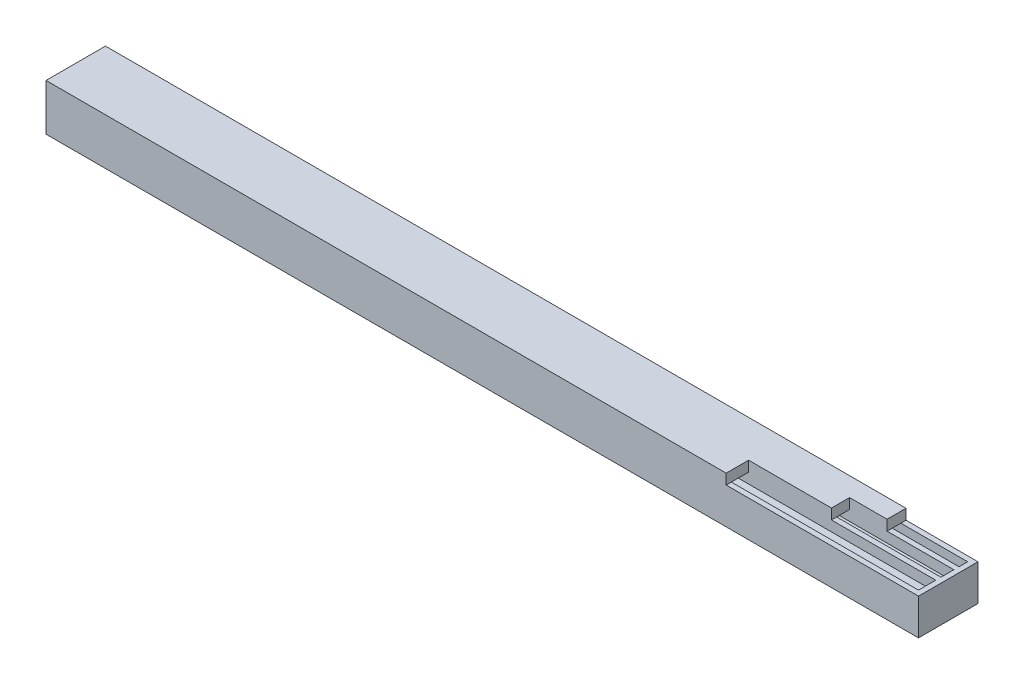
ISO-10303-21;
HEADER;
FILE_DESCRIPTION(('STEP AP214'),'2;1');
FILE_NAME('part.step','',(''),(''),'','','');
FILE_SCHEMA(('AUTOMOTIVE_DESIGN { 1 0 10303 214 1 1 1 1 }'));
ENDSEC;
DATA;
#1=APPLICATION_CONTEXT('core data for automotive mechanical design processes');
#2=APPLICATION_PROTOCOL_DEFINITION('international standard','automotive_design',2000,#1);
#3=PRODUCT_CONTEXT('',#1,'mechanical');
#4=PRODUCT('Part','Part','',(#3));
#5=PRODUCT_RELATED_PRODUCT_CATEGORY('part','',(#4));
#6=PRODUCT_DEFINITION_FORMATION('','',#4);
#7=PRODUCT_DEFINITION_CONTEXT('part definition',#1,'design');
#8=PRODUCT_DEFINITION('design','',#6,#7);
#9=PRODUCT_DEFINITION_SHAPE('','',#8);
#10=(LENGTH_UNIT() NAMED_UNIT(*) SI_UNIT(.MILLI.,.METRE.));
#11=(NAMED_UNIT(*) PLANE_ANGLE_UNIT() SI_UNIT($,.RADIAN.));
#12=(NAMED_UNIT(*) SI_UNIT($,.STERADIAN.) SOLID_ANGLE_UNIT());
#13=UNCERTAINTY_MEASURE_WITH_UNIT(LENGTH_MEASURE(1.E-05),#10,'distance_accuracy_value','');
#14=(GEOMETRIC_REPRESENTATION_CONTEXT(3) GLOBAL_UNCERTAINTY_ASSIGNED_CONTEXT((#13)) GLOBAL_UNIT_ASSIGNED_CONTEXT((#10,
#11,#12)) REPRESENTATION_CONTEXT('',''));
#15=CARTESIAN_POINT('',(0.,0.,0.));
#16=DIRECTION('',(0.,0.,1.));
#17=DIRECTION('',(1.,0.,0.));
#18=AXIS2_PLACEMENT_3D('',#15,#16,#17);
#19=CARTESIAN_POINT('',(-3.,-15.,26.5));
#20=DIRECTION('',(-1.,0.,0.));
#21=DIRECTION('',(0.,0.,1.));
#22=AXIS2_PLACEMENT_3D('',#19,#20,#21);
#23=PLANE('',#22);
#24=DIRECTION('',(0.,1.,0.));
#25=VECTOR('',#24,1.);
#26=CARTESIAN_POINT('',(-3.,-15.,26.5));
#27=LINE('',#26,#25);
#28=CARTESIAN_POINT('',(-3.,-15.,26.5));
#29=VERTEX_POINT('',#28);
#30=CARTESIAN_POINT('',(-3.,12.,26.5));
#31=VERTEX_POINT('',#30);
#32=EDGE_CURVE('E36',#29,#31,#27,.T.);
#33=ORIENTED_EDGE('',*,*,#32,.T.);
#34=DIRECTION('',(0.,0.,1.));
#35=VECTOR('',#34,1.);
#36=CARTESIAN_POINT('',(-3.,12.,26.5));
#37=LINE('',#36,#35);
#38=CARTESIAN_POINT('',(-3.,12.,-8.));
#39=VERTEX_POINT('',#38);
#40=EDGE_CURVE('E211',#39,#31,#37,.T.);
#41=ORIENTED_EDGE('',*,*,#40,.F.);
#42=DIRECTION('',(0.,1.,0.));
#43=VECTOR('',#42,1.);
#44=CARTESIAN_POINT('',(-3.,-15.,-8.));
#45=LINE('',#44,#43);
#46=CARTESIAN_POINT('',(-3.,-15.,-8.));
#47=VERTEX_POINT('',#46);
#48=EDGE_CURVE('E41',#47,#39,#45,.T.);
#49=ORIENTED_EDGE('',*,*,#48,.F.);
#50=DIRECTION('',(0.,0.,1.));
#51=VECTOR('',#50,1.);
#52=CARTESIAN_POINT('',(-3.,-15.,26.5));
#53=LINE('',#52,#51);
#54=EDGE_CURVE('E363',#47,#29,#53,.T.);
#55=ORIENTED_EDGE('',*,*,#54,.T.);
#56=EDGE_LOOP('',(#33,#41,#49,#55));
#57=FACE_BOUND('',#56,.T.);
#58=ADVANCED_FACE('F33',(#57),#23,.T.);
#59=CARTESIAN_POINT('',(-3.,-15.,-8.));
#60=DIRECTION('',(0.,0.,-1.));
#61=DIRECTION('',(-1.,0.,0.));
#62=AXIS2_PLACEMENT_3D('',#59,#60,#61);
#63=PLANE('',#62);
#64=ORIENTED_EDGE('',*,*,#48,.T.);
#65=DIRECTION('',(-1.,0.,0.));
#66=VECTOR('',#65,1.);
#67=CARTESIAN_POINT('',(-3.,12.,-8.));
#68=LINE('',#67,#66);
#69=CARTESIAN_POINT('',(461.264937975209,12.,-8.));
#70=VERTEX_POINT('',#69);
#71=EDGE_CURVE('E202',#70,#39,#68,.T.);
#72=ORIENTED_EDGE('',*,*,#71,.F.);
#73=DIRECTION('',(0.,-1.,0.));
#74=VECTOR('',#73,1.);
#75=CARTESIAN_POINT('',(461.264937975209,12.,-8.));
#76=LINE('',#75,#74);
#77=CARTESIAN_POINT('',(461.264937975209,5.99999999999999,-8.));
#78=VERTEX_POINT('',#77);
#79=EDGE_CURVE('E233',#70,#78,#76,.T.);
#80=ORIENTED_EDGE('',*,*,#79,.T.);
#81=DIRECTION('',(-1.,0.,0.));
#82=VECTOR('',#81,1.);
#83=CARTESIAN_POINT('',(-3.,5.99999999999999,-8.));
#84=LINE('',#83,#82);
#85=CARTESIAN_POINT('',(503.,5.99999999999999,-8.));
#86=VERTEX_POINT('',#85);
#87=EDGE_CURVE('E361',#86,#78,#84,.T.);
#88=ORIENTED_EDGE('',*,*,#87,.F.);
#89=DIRECTION('',(0.,1.,0.));
#90=VECTOR('',#89,1.);
#91=CARTESIAN_POINT('',(503.,-15.,-8.));
#92=LINE('',#91,#90);
#93=CARTESIAN_POINT('',(503.,-15.,-8.));
#94=VERTEX_POINT('',#93);
#95=EDGE_CURVE('E208',#94,#86,#92,.T.);
#96=ORIENTED_EDGE('',*,*,#95,.F.);
#97=DIRECTION('',(-1.,0.,0.));
#98=VECTOR('',#97,1.);
#99=CARTESIAN_POINT('',(-3.,-15.,-8.));
#100=LINE('',#99,#98);
#101=EDGE_CURVE('E204',#94,#47,#100,.T.);
#102=ORIENTED_EDGE('',*,*,#101,.T.);
#103=EDGE_LOOP('',(#64,#72,#80,#88,#96,#102));
#104=FACE_BOUND('',#103,.T.);
#105=ADVANCED_FACE('F199',(#104),#63,.T.);
#106=CARTESIAN_POINT('',(503.,-15.,26.5));
#107=DIRECTION('',(1.,0.,0.));
#108=DIRECTION('',(0.,0.,-1.));
#109=AXIS2_PLACEMENT_3D('',#106,#107,#108);
#110=PLANE('',#109);
#111=ORIENTED_EDGE('',*,*,#95,.T.);
#112=DIRECTION('',(0.,0.,-1.));
#113=VECTOR('',#112,1.);
#114=CARTESIAN_POINT('',(503.,5.99999999999999,-8.));
#115=LINE('',#114,#113);
#116=CARTESIAN_POINT('',(503.,5.99999999999999,26.5));
#117=VERTEX_POINT('',#116);
#118=EDGE_CURVE('E358',#117,#86,#115,.T.);
#119=ORIENTED_EDGE('',*,*,#118,.F.);
#120=DIRECTION('',(0.,1.,0.));
#121=VECTOR('',#120,1.);
#122=CARTESIAN_POINT('',(503.,-15.,26.5));
#123=LINE('',#122,#121);
#124=CARTESIAN_POINT('',(503.,-15.,26.5));
#125=VERTEX_POINT('',#124);
#126=EDGE_CURVE('E372',#125,#117,#123,.T.);
#127=ORIENTED_EDGE('',*,*,#126,.F.);
#128=DIRECTION('',(0.,0.,-1.));
#129=VECTOR('',#128,1.);
#130=CARTESIAN_POINT('',(503.,-15.,26.5));
#131=LINE('',#130,#129);
#132=EDGE_CURVE('E368',#125,#94,#131,.T.);
#133=ORIENTED_EDGE('',*,*,#132,.T.);
#134=EDGE_LOOP('',(#111,#119,#127,#133));
#135=FACE_BOUND('',#134,.T.);
#136=ADVANCED_FACE('F382',(#135),#110,.T.);
#137=CARTESIAN_POINT('',(-3.,-15.,26.5));
#138=DIRECTION('',(0.,0.,1.));
#139=DIRECTION('',(1.,0.,0.));
#140=AXIS2_PLACEMENT_3D('',#137,#138,#139);
#141=PLANE('',#140);
#142=ORIENTED_EDGE('',*,*,#126,.T.);
#143=DIRECTION('',(1.,0.,0.));
#144=VECTOR('',#143,1.);
#145=CARTESIAN_POINT('',(-3.,5.99999999999999,26.5));
#146=LINE('',#145,#144);
#147=CARTESIAN_POINT('',(391.456572890163,5.99999999999999,26.5));
#148=VERTEX_POINT('',#147);
#149=EDGE_CURVE('E356',#148,#117,#146,.T.);
#150=ORIENTED_EDGE('',*,*,#149,.F.);
#151=DIRECTION('',(0.,-1.,0.));
#152=VECTOR('',#151,1.);
#153=CARTESIAN_POINT('',(391.456572890163,12.,26.5));
#154=LINE('',#153,#152);
#155=CARTESIAN_POINT('',(391.456572890163,12.,26.5));
#156=VERTEX_POINT('',#155);
#157=EDGE_CURVE('E255',#156,#148,#154,.T.);
#158=ORIENTED_EDGE('',*,*,#157,.F.);
#159=DIRECTION('',(1.,0.,0.));
#160=VECTOR('',#159,1.);
#161=CARTESIAN_POINT('',(391.456572890163,12.,26.5));
#162=LINE('',#161,#160);
#163=EDGE_CURVE('E214',#31,#156,#162,.T.);
#164=ORIENTED_EDGE('',*,*,#163,.F.);
#165=ORIENTED_EDGE('',*,*,#32,.F.);
#166=DIRECTION('',(1.,0.,0.));
#167=VECTOR('',#166,1.);
#168=CARTESIAN_POINT('',(-3.,-15.,26.5));
#169=LINE('',#168,#167);
#170=EDGE_CURVE('E365',#29,#125,#169,.T.);
#171=ORIENTED_EDGE('',*,*,#170,.T.);
#172=EDGE_LOOP('',(#142,#150,#158,#164,#165,#171));
#173=FACE_BOUND('',#172,.T.);
#174=ADVANCED_FACE('F377',(#173),#141,.T.);
#175=CARTESIAN_POINT('',(0.,-15.,0.));
#176=DIRECTION('',(0.,-1.,0.));
#177=DIRECTION('',(0.,0.,-1.));
#178=AXIS2_PLACEMENT_3D('',#175,#176,#177);
#179=PLANE('',#178);
#180=ORIENTED_EDGE('',*,*,#54,.F.);
#181=ORIENTED_EDGE('',*,*,#101,.F.);
#182=ORIENTED_EDGE('',*,*,#132,.F.);
#183=ORIENTED_EDGE('',*,*,#170,.F.);
#184=EDGE_LOOP('',(#180,#181,#182,#183));
#185=FACE_BOUND('',#184,.T.);
#186=ADVANCED_FACE('F485',(#185),#179,.T.);
#187=CARTESIAN_POINT('',(0.,5.99999999999999,0.));
#188=DIRECTION('',(0.,1.,0.));
#189=DIRECTION('',(0.,0.,1.));
#190=AXIS2_PLACEMENT_3D('',#187,#188,#189);
#191=PLANE('',#190);
#192=DIRECTION('',(0.,0.,-1.));
#193=VECTOR('',#192,1.);
#194=CARTESIAN_POINT('',(461.264937975209,5.99999999999999,-8.));
#195=LINE('',#194,#193);
#196=CARTESIAN_POINT('',(461.264937975209,5.99999999999999,3.));
#197=VERTEX_POINT('',#196);
#198=CARTESIAN_POINT('',(461.264937975209,5.99999999999999,0.));
#199=VERTEX_POINT('',#198);
#200=EDGE_CURVE('E43',#197,#199,#195,.T.);
#201=ORIENTED_EDGE('',*,*,#200,.F.);
#202=DIRECTION('',(-1.,0.,0.));
#203=VECTOR('',#202,1.);
#204=CARTESIAN_POINT('',(500.,5.99999999999999,3.));
#205=LINE('',#204,#203);
#206=CARTESIAN_POINT('',(500.,5.99999999999999,3.));
#207=VERTEX_POINT('',#206);
#208=EDGE_CURVE('E262',#207,#197,#205,.T.);
#209=ORIENTED_EDGE('',*,*,#208,.F.);
#210=DIRECTION('',(0.,0.,-1.));
#211=VECTOR('',#210,1.);
#212=CARTESIAN_POINT('',(500.,5.99999999999999,3.));
#213=LINE('',#212,#211);
#214=CARTESIAN_POINT('',(500.,5.99999999999999,10.5));
#215=VERTEX_POINT('',#214);
#216=EDGE_CURVE('E259',#215,#207,#213,.T.);
#217=ORIENTED_EDGE('',*,*,#216,.F.);
#218=DIRECTION('',(1.,0.,0.));
#219=VECTOR('',#218,1.);
#220=CARTESIAN_POINT('',(500.,5.99999999999999,10.5));
#221=LINE('',#220,#219);
#222=CARTESIAN_POINT('',(439.515598099466,5.99999999999999,10.5));
#223=VERTEX_POINT('',#222);
#224=EDGE_CURVE('E51',#223,#215,#221,.T.);
#225=ORIENTED_EDGE('',*,*,#224,.F.);
#226=DIRECTION('',(0.,0.,-1.));
#227=VECTOR('',#226,1.);
#228=CARTESIAN_POINT('',(439.515598099466,5.99999999999999,3.));
#229=LINE('',#228,#227);
#230=CARTESIAN_POINT('',(439.515598099466,5.99999999999999,13.5));
#231=VERTEX_POINT('',#230);
#232=EDGE_CURVE('E239',#231,#223,#229,.T.);
#233=ORIENTED_EDGE('',*,*,#232,.F.);
#234=DIRECTION('',(-1.,0.,0.));
#235=VECTOR('',#234,1.);
#236=CARTESIAN_POINT('',(0.,5.99999999999999,13.5));
#237=LINE('',#236,#235);
#238=CARTESIAN_POINT('',(500.,5.99999999999999,13.5));
#239=VERTEX_POINT('',#238);
#240=EDGE_CURVE('E334',#239,#231,#237,.T.);
#241=ORIENTED_EDGE('',*,*,#240,.F.);
#242=DIRECTION('',(0.,0.,-1.));
#243=VECTOR('',#242,1.);
#244=CARTESIAN_POINT('',(500.,5.99999999999999,13.5));
#245=LINE('',#244,#243);
#246=CARTESIAN_POINT('',(500.,5.99999999999999,23.5));
#247=VERTEX_POINT('',#246);
#248=EDGE_CURVE('E330',#247,#239,#245,.T.);
#249=ORIENTED_EDGE('',*,*,#248,.F.);
#250=DIRECTION('',(1.,0.,0.));
#251=VECTOR('',#250,1.);
#252=CARTESIAN_POINT('',(0.,5.99999999999999,23.5));
#253=LINE('',#252,#251);
#254=CARTESIAN_POINT('',(391.456572890163,5.99999999999999,23.5));
#255=VERTEX_POINT('',#254);
#256=EDGE_CURVE('E326',#255,#247,#253,.T.);
#257=ORIENTED_EDGE('',*,*,#256,.F.);
#258=DIRECTION('',(0.,0.,-1.));
#259=VECTOR('',#258,1.);
#260=CARTESIAN_POINT('',(391.456572890163,5.99999999999999,13.5));
#261=LINE('',#260,#259);
#262=EDGE_CURVE('E234',#148,#255,#261,.T.);
#263=ORIENTED_EDGE('',*,*,#262,.F.);
#264=ORIENTED_EDGE('',*,*,#149,.T.);
#265=ORIENTED_EDGE('',*,*,#118,.T.);
#266=ORIENTED_EDGE('',*,*,#87,.T.);
#267=CARTESIAN_POINT('',(461.264937975209,5.99999999999999,-5.));
#268=VERTEX_POINT('',#267);
#269=EDGE_CURVE('E11',#268,#78,#195,.T.);
#270=ORIENTED_EDGE('',*,*,#269,.F.);
#271=DIRECTION('',(-1.,0.,0.));
#272=VECTOR('',#271,1.);
#273=CARTESIAN_POINT('',(0.,5.99999999999999,-5.));
#274=LINE('',#273,#272);
#275=CARTESIAN_POINT('',(500.,5.99999999999999,-5.));
#276=VERTEX_POINT('',#275);
#277=EDGE_CURVE('E301',#276,#268,#274,.T.);
#278=ORIENTED_EDGE('',*,*,#277,.F.);
#279=DIRECTION('',(0.,0.,-1.));
#280=VECTOR('',#279,1.);
#281=CARTESIAN_POINT('',(500.,5.99999999999999,-5.));
#282=LINE('',#281,#280);
#283=CARTESIAN_POINT('',(500.,5.99999999999999,0.));
#284=VERTEX_POINT('',#283);
#285=EDGE_CURVE('E297',#284,#276,#282,.T.);
#286=ORIENTED_EDGE('',*,*,#285,.F.);
#287=DIRECTION('',(1.,0.,0.));
#288=VECTOR('',#287,1.);
#289=CARTESIAN_POINT('',(0.,5.99999999999999,0.));
#290=LINE('',#289,#288);
#291=EDGE_CURVE('E292',#199,#284,#290,.T.);
#292=ORIENTED_EDGE('',*,*,#291,.F.);
#293=EDGE_LOOP('',(#201,#209,#217,#225,#233,#241,#249,#257,#263,#264,#265,#266,#270,#278,#286,#292));
#294=FACE_BOUND('',#293,.T.);
#295=ADVANCED_FACE('F384',(#294),#191,.T.);
#296=CARTESIAN_POINT('',(0.,5.99999999999999,13.5));
#297=DIRECTION('',(1.,0.,0.));
#298=DIRECTION('',(0.,0.,-1.));
#299=AXIS2_PLACEMENT_3D('',#296,#297,#298);
#300=PLANE('',#299);
#301=DIRECTION('',(0.,0.,1.));
#302=VECTOR('',#301,1.);
#303=CARTESIAN_POINT('',(0.,0.,13.5));
#304=LINE('',#303,#302);
#305=CARTESIAN_POINT('',(0.,0.,13.5));
#306=VERTEX_POINT('',#305);
#307=CARTESIAN_POINT('',(0.,0.,23.5));
#308=VERTEX_POINT('',#307);
#309=EDGE_CURVE('E323',#306,#308,#304,.T.);
#310=ORIENTED_EDGE('',*,*,#309,.F.);
#311=DIRECTION('',(0.,-1.,0.));
#312=VECTOR('',#311,1.);
#313=CARTESIAN_POINT('',(0.,5.99999999999999,13.5));
#314=LINE('',#313,#312);
#315=CARTESIAN_POINT('',(0.,5.99999999999999,13.5));
#316=VERTEX_POINT('',#315);
#317=EDGE_CURVE('E337',#316,#306,#314,.T.);
#318=ORIENTED_EDGE('',*,*,#317,.F.);
#319=DIRECTION('',(0.,0.,1.));
#320=VECTOR('',#319,1.);
#321=CARTESIAN_POINT('',(0.,5.99999999999999,13.5));
#322=LINE('',#321,#320);
#323=CARTESIAN_POINT('',(0.,5.99999999999999,23.5));
#324=VERTEX_POINT('',#323);
#325=EDGE_CURVE('E324',#316,#324,#322,.T.);
#326=ORIENTED_EDGE('',*,*,#325,.T.);
#327=DIRECTION('',(0.,-1.,0.));
#328=VECTOR('',#327,1.);
#329=CARTESIAN_POINT('',(0.,5.99999999999999,23.5));
#330=LINE('',#329,#328);
#331=EDGE_CURVE('E353',#324,#308,#330,.T.);
#332=ORIENTED_EDGE('',*,*,#331,.T.);
#333=EDGE_LOOP('',(#310,#318,#326,#332));
#334=FACE_BOUND('',#333,.T.);
#335=ADVANCED_FACE('F460',(#334),#300,.T.);
#336=CARTESIAN_POINT('',(0.,5.99999999999999,23.5));
#337=DIRECTION('',(0.,0.,-1.));
#338=DIRECTION('',(-1.,0.,0.));
#339=AXIS2_PLACEMENT_3D('',#336,#337,#338);
#340=PLANE('',#339);
#341=DIRECTION('',(1.,0.,0.));
#342=VECTOR('',#341,1.);
#343=CARTESIAN_POINT('',(0.,0.,23.5));
#344=LINE('',#343,#342);
#345=CARTESIAN_POINT('',(500.,0.,23.5));
#346=VERTEX_POINT('',#345);
#347=EDGE_CURVE('E340',#308,#346,#344,.T.);
#348=ORIENTED_EDGE('',*,*,#347,.F.);
#349=ORIENTED_EDGE('',*,*,#331,.F.);
#350=EDGE_CURVE('E328',#324,#255,#253,.T.);
#351=ORIENTED_EDGE('',*,*,#350,.T.);
#352=ORIENTED_EDGE('',*,*,#256,.T.);
#353=DIRECTION('',(0.,-1.,0.));
#354=VECTOR('',#353,1.);
#355=CARTESIAN_POINT('',(500.,5.99999999999999,23.5));
#356=LINE('',#355,#354);
#357=EDGE_CURVE('E351',#247,#346,#356,.T.);
#358=ORIENTED_EDGE('',*,*,#357,.T.);
#359=EDGE_LOOP('',(#348,#349,#351,#352,#358));
#360=FACE_BOUND('',#359,.T.);
#361=ADVANCED_FACE('F464',(#360),#340,.T.);
#362=CARTESIAN_POINT('',(500.,5.99999999999999,13.5));
#363=DIRECTION('',(-1.,0.,0.));
#364=DIRECTION('',(0.,0.,1.));
#365=AXIS2_PLACEMENT_3D('',#362,#363,#364);
#366=PLANE('',#365);
#367=DIRECTION('',(0.,0.,-1.));
#368=VECTOR('',#367,1.);
#369=CARTESIAN_POINT('',(500.,0.,13.5));
#370=LINE('',#369,#368);
#371=CARTESIAN_POINT('',(500.,0.,13.5));
#372=VERTEX_POINT('',#371);
#373=EDGE_CURVE('E343',#346,#372,#370,.T.);
#374=ORIENTED_EDGE('',*,*,#373,.F.);
#375=ORIENTED_EDGE('',*,*,#357,.F.);
#376=ORIENTED_EDGE('',*,*,#248,.T.);
#377=DIRECTION('',(0.,-1.,0.));
#378=VECTOR('',#377,1.);
#379=CARTESIAN_POINT('',(500.,5.99999999999999,13.5));
#380=LINE('',#379,#378);
#381=EDGE_CURVE('E349',#239,#372,#380,.T.);
#382=ORIENTED_EDGE('',*,*,#381,.T.);
#383=EDGE_LOOP('',(#374,#375,#376,#382));
#384=FACE_BOUND('',#383,.T.);
#385=ADVANCED_FACE('F444',(#384),#366,.T.);
#386=CARTESIAN_POINT('',(0.,5.99999999999999,13.5));
#387=DIRECTION('',(0.,0.,1.));
#388=DIRECTION('',(1.,0.,0.));
#389=AXIS2_PLACEMENT_3D('',#386,#387,#388);
#390=PLANE('',#389);
#391=DIRECTION('',(-1.,0.,0.));
#392=VECTOR('',#391,1.);
#393=CARTESIAN_POINT('',(0.,0.,13.5));
#394=LINE('',#393,#392);
#395=EDGE_CURVE('E327',#372,#306,#394,.T.);
#396=ORIENTED_EDGE('',*,*,#395,.F.);
#397=ORIENTED_EDGE('',*,*,#381,.F.);
#398=ORIENTED_EDGE('',*,*,#240,.T.);
#399=DIRECTION('',(0.,-1.,0.));
#400=VECTOR('',#399,1.);
#401=CARTESIAN_POINT('',(439.515598099466,12.,13.5));
#402=LINE('',#401,#400);
#403=CARTESIAN_POINT('',(439.515598099466,12.,13.5));
#404=VERTEX_POINT('',#403);
#405=EDGE_CURVE('E249',#404,#231,#402,.T.);
#406=ORIENTED_EDGE('',*,*,#405,.F.);
#407=DIRECTION('',(1.,0.,0.));
#408=VECTOR('',#407,1.);
#409=CARTESIAN_POINT('',(439.515598099466,12.,13.5));
#410=LINE('',#409,#408);
#411=CARTESIAN_POINT('',(391.456572890163,12.,13.5));
#412=VERTEX_POINT('',#411);
#413=EDGE_CURVE('E226',#412,#404,#410,.T.);
#414=ORIENTED_EDGE('',*,*,#413,.F.);
#415=DIRECTION('',(0.,-1.,0.));
#416=VECTOR('',#415,1.);
#417=CARTESIAN_POINT('',(391.456572890163,12.,13.5));
#418=LINE('',#417,#416);
#419=CARTESIAN_POINT('',(391.456572890163,5.99999999999999,13.5));
#420=VERTEX_POINT('',#419);
#421=EDGE_CURVE('E252',#412,#420,#418,.T.);
#422=ORIENTED_EDGE('',*,*,#421,.T.);
#423=EDGE_CURVE('E333',#420,#316,#237,.T.);
#424=ORIENTED_EDGE('',*,*,#423,.T.);
#425=ORIENTED_EDGE('',*,*,#317,.T.);
#426=EDGE_LOOP('',(#396,#397,#398,#406,#414,#422,#424,#425));
#427=FACE_BOUND('',#426,.T.);
#428=ADVANCED_FACE('F439',(#427),#390,.T.);
#429=CARTESIAN_POINT('',(0.,5.99999999999999,-5.));
#430=DIRECTION('',(1.,0.,0.));
#431=DIRECTION('',(0.,0.,-1.));
#432=AXIS2_PLACEMENT_3D('',#429,#430,#431);
#433=PLANE('',#432);
#434=DIRECTION('',(0.,0.,1.));
#435=VECTOR('',#434,1.);
#436=CARTESIAN_POINT('',(0.,0.,-5.));
#437=LINE('',#436,#435);
#438=CARTESIAN_POINT('',(0.,0.,-5.));
#439=VERTEX_POINT('',#438);
#440=CARTESIAN_POINT('',(0.,0.,0.));
#441=VERTEX_POINT('',#440);
#442=EDGE_CURVE('E289',#439,#441,#437,.T.);
#443=ORIENTED_EDGE('',*,*,#442,.F.);
#444=DIRECTION('',(0.,-1.,0.));
#445=VECTOR('',#444,1.);
#446=CARTESIAN_POINT('',(0.,5.99999999999999,-5.));
#447=LINE('',#446,#445);
#448=CARTESIAN_POINT('',(0.,5.99999999999999,-5.));
#449=VERTEX_POINT('',#448);
#450=EDGE_CURVE('E304',#449,#439,#447,.T.);
#451=ORIENTED_EDGE('',*,*,#450,.F.);
#452=DIRECTION('',(0.,0.,1.));
#453=VECTOR('',#452,1.);
#454=CARTESIAN_POINT('',(0.,5.99999999999999,-5.));
#455=LINE('',#454,#453);
#456=CARTESIAN_POINT('',(0.,5.99999999999999,0.));
#457=VERTEX_POINT('',#456);
#458=EDGE_CURVE('E290',#449,#457,#455,.T.);
#459=ORIENTED_EDGE('',*,*,#458,.T.);
#460=DIRECTION('',(0.,-1.,0.));
#461=VECTOR('',#460,1.);
#462=CARTESIAN_POINT('',(0.,5.99999999999999,0.));
#463=LINE('',#462,#461);
#464=EDGE_CURVE('E320',#457,#441,#463,.T.);
#465=ORIENTED_EDGE('',*,*,#464,.T.);
#466=EDGE_LOOP('',(#443,#451,#459,#465));
#467=FACE_BOUND('',#466,.T.);
#468=ADVANCED_FACE('F403',(#467),#433,.T.);
#469=CARTESIAN_POINT('',(0.,5.99999999999999,0.));
#470=DIRECTION('',(0.,0.,-1.));
#471=DIRECTION('',(-1.,0.,0.));
#472=AXIS2_PLACEMENT_3D('',#469,#470,#471);
#473=PLANE('',#472);
#474=DIRECTION('',(1.,0.,0.));
#475=VECTOR('',#474,1.);
#476=CARTESIAN_POINT('',(0.,0.,0.));
#477=LINE('',#476,#475);
#478=CARTESIAN_POINT('',(500.,0.,0.));
#479=VERTEX_POINT('',#478);
#480=EDGE_CURVE('E307',#441,#479,#477,.T.);
#481=ORIENTED_EDGE('',*,*,#480,.F.);
#482=ORIENTED_EDGE('',*,*,#464,.F.);
#483=EDGE_CURVE('E294',#457,#199,#290,.T.);
#484=ORIENTED_EDGE('',*,*,#483,.T.);
#485=ORIENTED_EDGE('',*,*,#291,.T.);
#486=DIRECTION('',(0.,-1.,0.));
#487=VECTOR('',#486,1.);
#488=CARTESIAN_POINT('',(500.,5.99999999999999,0.));
#489=LINE('',#488,#487);
#490=EDGE_CURVE('E318',#284,#479,#489,.T.);
#491=ORIENTED_EDGE('',*,*,#490,.T.);
#492=EDGE_LOOP('',(#481,#482,#484,#485,#491));
#493=FACE_BOUND('',#492,.T.);
#494=ADVANCED_FACE('F405',(#493),#473,.T.);
#495=CARTESIAN_POINT('',(500.,5.99999999999999,-5.));
#496=DIRECTION('',(-1.,0.,0.));
#497=DIRECTION('',(0.,0.,1.));
#498=AXIS2_PLACEMENT_3D('',#495,#496,#497);
#499=PLANE('',#498);
#500=DIRECTION('',(0.,0.,-1.));
#501=VECTOR('',#500,1.);
#502=CARTESIAN_POINT('',(500.,0.,-5.));
#503=LINE('',#502,#501);
#504=CARTESIAN_POINT('',(500.,0.,-5.));
#505=VERTEX_POINT('',#504);
#506=EDGE_CURVE('E310',#479,#505,#503,.T.);
#507=ORIENTED_EDGE('',*,*,#506,.F.);
#508=ORIENTED_EDGE('',*,*,#490,.F.);
#509=ORIENTED_EDGE('',*,*,#285,.T.);
#510=DIRECTION('',(0.,-1.,0.));
#511=VECTOR('',#510,1.);
#512=CARTESIAN_POINT('',(500.,5.99999999999999,-5.));
#513=LINE('',#512,#511);
#514=EDGE_CURVE('E316',#276,#505,#513,.T.);
#515=ORIENTED_EDGE('',*,*,#514,.T.);
#516=EDGE_LOOP('',(#507,#508,#509,#515));
#517=FACE_BOUND('',#516,.T.);
#518=ADVANCED_FACE('F411',(#517),#499,.T.);
#519=CARTESIAN_POINT('',(0.,5.99999999999999,-5.));
#520=DIRECTION('',(0.,0.,1.));
#521=DIRECTION('',(1.,0.,0.));
#522=AXIS2_PLACEMENT_3D('',#519,#520,#521);
#523=PLANE('',#522);
#524=DIRECTION('',(-1.,0.,0.));
#525=VECTOR('',#524,1.);
#526=CARTESIAN_POINT('',(0.,0.,-5.));
#527=LINE('',#526,#525);
#528=EDGE_CURVE('E293',#505,#439,#527,.T.);
#529=ORIENTED_EDGE('',*,*,#528,.F.);
#530=ORIENTED_EDGE('',*,*,#514,.F.);
#531=ORIENTED_EDGE('',*,*,#277,.T.);
#532=EDGE_CURVE('E300',#268,#449,#274,.T.);
#533=ORIENTED_EDGE('',*,*,#532,.T.);
#534=ORIENTED_EDGE('',*,*,#450,.T.);
#535=EDGE_LOOP('',(#529,#530,#531,#533,#534));
#536=FACE_BOUND('',#535,.T.);
#537=ADVANCED_FACE('F394',(#536),#523,.T.);
#538=CARTESIAN_POINT('',(500.,5.99999999999999,3.));
#539=DIRECTION('',(-1.,0.,0.));
#540=DIRECTION('',(0.,0.,1.));
#541=AXIS2_PLACEMENT_3D('',#538,#539,#540);
#542=PLANE('',#541);
#543=DIRECTION('',(0.,0.,-1.));
#544=VECTOR('',#543,1.);
#545=CARTESIAN_POINT('',(500.,0.,3.));
#546=LINE('',#545,#544);
#547=CARTESIAN_POINT('',(500.,0.,10.5));
#548=VERTEX_POINT('',#547);
#549=CARTESIAN_POINT('',(500.,0.,3.));
#550=VERTEX_POINT('',#549);
#551=EDGE_CURVE('E258',#548,#550,#546,.T.);
#552=ORIENTED_EDGE('',*,*,#551,.F.);
#553=DIRECTION('',(0.,-1.,0.));
#554=VECTOR('',#553,1.);
#555=CARTESIAN_POINT('',(500.,5.99999999999999,10.5));
#556=LINE('',#555,#554);
#557=EDGE_CURVE('E270',#215,#548,#556,.T.);
#558=ORIENTED_EDGE('',*,*,#557,.F.);
#559=ORIENTED_EDGE('',*,*,#216,.T.);
#560=DIRECTION('',(0.,-1.,0.));
#561=VECTOR('',#560,1.);
#562=CARTESIAN_POINT('',(500.,5.99999999999999,3.));
#563=LINE('',#562,#561);
#564=EDGE_CURVE('E286',#207,#550,#563,.T.);
#565=ORIENTED_EDGE('',*,*,#564,.T.);
#566=EDGE_LOOP('',(#552,#558,#559,#565));
#567=FACE_BOUND('',#566,.T.);
#568=ADVANCED_FACE('F420',(#567),#542,.T.);
#569=CARTESIAN_POINT('',(500.,5.99999999999999,3.));
#570=DIRECTION('',(0.,0.,1.));
#571=DIRECTION('',(1.,0.,0.));
#572=AXIS2_PLACEMENT_3D('',#569,#570,#571);
#573=PLANE('',#572);
#574=DIRECTION('',(-1.,0.,0.));
#575=VECTOR('',#574,1.);
#576=CARTESIAN_POINT('',(500.,0.,3.));
#577=LINE('',#576,#575);
#578=CARTESIAN_POINT('',(0.,0.,3.));
#579=VERTEX_POINT('',#578);
#580=EDGE_CURVE('E273',#550,#579,#577,.T.);
#581=ORIENTED_EDGE('',*,*,#580,.F.);
#582=ORIENTED_EDGE('',*,*,#564,.F.);
#583=ORIENTED_EDGE('',*,*,#208,.T.);
#584=DIRECTION('',(0.,-1.,0.));
#585=VECTOR('',#584,1.);
#586=CARTESIAN_POINT('',(461.264937975209,12.,3.));
#587=LINE('',#586,#585);
#588=CARTESIAN_POINT('',(461.264937975209,12.,3.));
#589=VERTEX_POINT('',#588);
#590=EDGE_CURVE('E243',#589,#197,#587,.T.);
#591=ORIENTED_EDGE('',*,*,#590,.F.);
#592=DIRECTION('',(1.,0.,0.));
#593=VECTOR('',#592,1.);
#594=CARTESIAN_POINT('',(461.264937975209,12.,3.));
#595=LINE('',#594,#593);
#596=CARTESIAN_POINT('',(439.515598099466,12.,3.));
#597=VERTEX_POINT('',#596);
#598=EDGE_CURVE('E230',#597,#589,#595,.T.);
#599=ORIENTED_EDGE('',*,*,#598,.F.);
#600=DIRECTION('',(0.,-1.,0.));
#601=VECTOR('',#600,1.);
#602=CARTESIAN_POINT('',(439.515598099466,12.,3.));
#603=LINE('',#602,#601);
#604=CARTESIAN_POINT('',(439.515598099466,5.99999999999999,3.));
#605=VERTEX_POINT('',#604);
#606=EDGE_CURVE('E246',#597,#605,#603,.T.);
#607=ORIENTED_EDGE('',*,*,#606,.T.);
#608=CARTESIAN_POINT('',(0.,5.99999999999999,3.));
#609=VERTEX_POINT('',#608);
#610=EDGE_CURVE('E59',#605,#609,#205,.T.);
#611=ORIENTED_EDGE('',*,*,#610,.T.);
#612=DIRECTION('',(0.,-1.,0.));
#613=VECTOR('',#612,1.);
#614=CARTESIAN_POINT('',(0.,5.99999999999999,3.));
#615=LINE('',#614,#613);
#616=EDGE_CURVE('E284',#609,#579,#615,.T.);
#617=ORIENTED_EDGE('',*,*,#616,.T.);
#618=EDGE_LOOP('',(#581,#582,#583,#591,#599,#607,#611,#617));
#619=FACE_BOUND('',#618,.T.);
#620=ADVANCED_FACE('F416',(#619),#573,.T.);
#621=CARTESIAN_POINT('',(0.,5.99999999999999,3.));
#622=DIRECTION('',(1.,0.,0.));
#623=DIRECTION('',(0.,0.,-1.));
#624=AXIS2_PLACEMENT_3D('',#621,#622,#623);
#625=PLANE('',#624);
#626=DIRECTION('',(0.,0.,1.));
#627=VECTOR('',#626,1.);
#628=CARTESIAN_POINT('',(0.,0.,3.));
#629=LINE('',#628,#627);
#630=CARTESIAN_POINT('',(0.,0.,10.5));
#631=VERTEX_POINT('',#630);
#632=EDGE_CURVE('E276',#579,#631,#629,.T.);
#633=ORIENTED_EDGE('',*,*,#632,.F.);
#634=ORIENTED_EDGE('',*,*,#616,.F.);
#635=DIRECTION('',(0.,0.,1.));
#636=VECTOR('',#635,1.);
#637=CARTESIAN_POINT('',(0.,5.99999999999999,3.));
#638=LINE('',#637,#636);
#639=CARTESIAN_POINT('',(0.,5.99999999999999,10.5));
#640=VERTEX_POINT('',#639);
#641=EDGE_CURVE('E265',#609,#640,#638,.T.);
#642=ORIENTED_EDGE('',*,*,#641,.T.);
#643=DIRECTION('',(0.,-1.,0.));
#644=VECTOR('',#643,1.);
#645=CARTESIAN_POINT('',(0.,5.99999999999999,10.5));
#646=LINE('',#645,#644);
#647=EDGE_CURVE('E282',#640,#631,#646,.T.);
#648=ORIENTED_EDGE('',*,*,#647,.T.);
#649=EDGE_LOOP('',(#633,#634,#642,#648));
#650=FACE_BOUND('',#649,.T.);
#651=ADVANCED_FACE('F552',(#650),#625,.T.);
#652=CARTESIAN_POINT('',(500.,5.99999999999999,10.5));
#653=DIRECTION('',(0.,0.,-1.));
#654=DIRECTION('',(-1.,0.,0.));
#655=AXIS2_PLACEMENT_3D('',#652,#653,#654);
#656=PLANE('',#655);
#657=DIRECTION('',(1.,0.,0.));
#658=VECTOR('',#657,1.);
#659=CARTESIAN_POINT('',(500.,0.,10.5));
#660=LINE('',#659,#658);
#661=EDGE_CURVE('E261',#631,#548,#660,.T.);
#662=ORIENTED_EDGE('',*,*,#661,.F.);
#663=ORIENTED_EDGE('',*,*,#647,.F.);
#664=EDGE_CURVE('E268',#640,#223,#221,.T.);
#665=ORIENTED_EDGE('',*,*,#664,.T.);
#666=ORIENTED_EDGE('',*,*,#224,.T.);
#667=ORIENTED_EDGE('',*,*,#557,.T.);
#668=EDGE_LOOP('',(#662,#663,#665,#666,#667));
#669=FACE_BOUND('',#668,.T.);
#670=ADVANCED_FACE('F427',(#669),#656,.T.);
#671=CARTESIAN_POINT('',(0.,0.,0.));
#672=DIRECTION('',(0.,-1.,0.));
#673=DIRECTION('',(0.,0.,-1.));
#674=AXIS2_PLACEMENT_3D('',#671,#672,#673);
#675=PLANE('',#674);
#676=ORIENTED_EDGE('',*,*,#528,.T.);
#677=ORIENTED_EDGE('',*,*,#442,.T.);
#678=ORIENTED_EDGE('',*,*,#480,.T.);
#679=ORIENTED_EDGE('',*,*,#506,.T.);
#680=EDGE_LOOP('',(#676,#677,#678,#679));
#681=FACE_BOUND('',#680,.T.);
#682=ADVANCED_FACE('F409',(#681),#675,.F.);
#683=ORIENTED_EDGE('',*,*,#395,.T.);
#684=ORIENTED_EDGE('',*,*,#309,.T.);
#685=ORIENTED_EDGE('',*,*,#347,.T.);
#686=ORIENTED_EDGE('',*,*,#373,.T.);
#687=EDGE_LOOP('',(#683,#684,#685,#686));
#688=FACE_BOUND('',#687,.T.);
#689=ADVANCED_FACE('F463',(#688),#675,.F.);
#690=ORIENTED_EDGE('',*,*,#661,.T.);
#691=ORIENTED_EDGE('',*,*,#551,.T.);
#692=ORIENTED_EDGE('',*,*,#580,.T.);
#693=ORIENTED_EDGE('',*,*,#632,.T.);
#694=EDGE_LOOP('',(#690,#691,#692,#693));
#695=FACE_BOUND('',#694,.T.);
#696=ADVANCED_FACE('F423',(#695),#675,.F.);
#697=CARTESIAN_POINT('',(0.,5.99999999999999,0.));
#698=DIRECTION('',(0.,-1.,0.));
#699=DIRECTION('',(0.,0.,-1.));
#700=AXIS2_PLACEMENT_3D('',#697,#698,#699);
#701=PLANE('',#700);
#702=ORIENTED_EDGE('',*,*,#350,.F.);
#703=ORIENTED_EDGE('',*,*,#325,.F.);
#704=ORIENTED_EDGE('',*,*,#423,.F.);
#705=EDGE_CURVE('E238',#255,#420,#261,.T.);
#706=ORIENTED_EDGE('',*,*,#705,.F.);
#707=EDGE_LOOP('',(#702,#703,#704,#706));
#708=FACE_BOUND('',#707,.T.);
#709=ADVANCED_FACE('F451',(#708),#701,.T.);
#710=ORIENTED_EDGE('',*,*,#483,.F.);
#711=ORIENTED_EDGE('',*,*,#458,.F.);
#712=ORIENTED_EDGE('',*,*,#532,.F.);
#713=EDGE_CURVE('E44',#199,#268,#195,.T.);
#714=ORIENTED_EDGE('',*,*,#713,.F.);
#715=EDGE_LOOP('',(#710,#711,#712,#714));
#716=FACE_BOUND('',#715,.T.);
#717=ADVANCED_FACE('F399',(#716),#701,.T.);
#718=ORIENTED_EDGE('',*,*,#610,.F.);
#719=EDGE_CURVE('E237',#223,#605,#229,.T.);
#720=ORIENTED_EDGE('',*,*,#719,.F.);
#721=ORIENTED_EDGE('',*,*,#664,.F.);
#722=ORIENTED_EDGE('',*,*,#641,.F.);
#723=EDGE_LOOP('',(#718,#720,#721,#722));
#724=FACE_BOUND('',#723,.T.);
#725=ADVANCED_FACE('F429',(#724),#701,.T.);
#726=CARTESIAN_POINT('',(391.456572890163,12.,13.5));
#727=DIRECTION('',(-1.,0.,0.));
#728=DIRECTION('',(0.,0.,1.));
#729=AXIS2_PLACEMENT_3D('',#726,#727,#728);
#730=PLANE('',#729);
#731=ORIENTED_EDGE('',*,*,#262,.T.);
#732=ORIENTED_EDGE('',*,*,#705,.T.);
#733=ORIENTED_EDGE('',*,*,#421,.F.);
#734=DIRECTION('',(0.,0.,-1.));
#735=VECTOR('',#734,1.);
#736=CARTESIAN_POINT('',(391.456572890163,12.,13.5));
#737=LINE('',#736,#735);
#738=EDGE_CURVE('E224',#156,#412,#737,.T.);
#739=ORIENTED_EDGE('',*,*,#738,.F.);
#740=ORIENTED_EDGE('',*,*,#157,.T.);
#741=EDGE_LOOP('',(#731,#732,#733,#739,#740));
#742=FACE_BOUND('',#741,.T.);
#743=ADVANCED_FACE('F455',(#742),#730,.F.);
#744=CARTESIAN_POINT('',(439.515598099466,12.,3.));
#745=DIRECTION('',(-1.,0.,0.));
#746=DIRECTION('',(0.,0.,1.));
#747=AXIS2_PLACEMENT_3D('',#744,#745,#746);
#748=PLANE('',#747);
#749=ORIENTED_EDGE('',*,*,#232,.T.);
#750=ORIENTED_EDGE('',*,*,#719,.T.);
#751=ORIENTED_EDGE('',*,*,#606,.F.);
#752=DIRECTION('',(0.,0.,-1.));
#753=VECTOR('',#752,1.);
#754=CARTESIAN_POINT('',(439.515598099466,12.,3.));
#755=LINE('',#754,#753);
#756=EDGE_CURVE('E228',#404,#597,#755,.T.);
#757=ORIENTED_EDGE('',*,*,#756,.F.);
#758=ORIENTED_EDGE('',*,*,#405,.T.);
#759=EDGE_LOOP('',(#749,#750,#751,#757,#758));
#760=FACE_BOUND('',#759,.T.);
#761=ADVANCED_FACE('F432',(#760),#748,.F.);
#762=CARTESIAN_POINT('',(461.264937975209,12.,-8.));
#763=DIRECTION('',(-1.,0.,0.));
#764=DIRECTION('',(0.,0.,1.));
#765=AXIS2_PLACEMENT_3D('',#762,#763,#764);
#766=PLANE('',#765);
#767=ORIENTED_EDGE('',*,*,#200,.T.);
#768=ORIENTED_EDGE('',*,*,#713,.T.);
#769=ORIENTED_EDGE('',*,*,#269,.T.);
#770=ORIENTED_EDGE('',*,*,#79,.F.);
#771=DIRECTION('',(0.,0.,-1.));
#772=VECTOR('',#771,1.);
#773=CARTESIAN_POINT('',(461.264937975209,12.,-8.));
#774=LINE('',#773,#772);
#775=EDGE_CURVE('E218',#589,#70,#774,.T.);
#776=ORIENTED_EDGE('',*,*,#775,.F.);
#777=ORIENTED_EDGE('',*,*,#590,.T.);
#778=EDGE_LOOP('',(#767,#768,#769,#770,#776,#777));
#779=FACE_BOUND('',#778,.T.);
#780=ADVANCED_FACE('F386',(#779),#766,.F.);
#781=CARTESIAN_POINT('',(0.,12.,0.));
#782=DIRECTION('',(0.,-1.,0.));
#783=DIRECTION('',(0.,0.,-1.));
#784=AXIS2_PLACEMENT_3D('',#781,#782,#783);
#785=PLANE('',#784);
#786=ORIENTED_EDGE('',*,*,#71,.T.);
#787=ORIENTED_EDGE('',*,*,#40,.T.);
#788=ORIENTED_EDGE('',*,*,#163,.T.);
#789=ORIENTED_EDGE('',*,*,#738,.T.);
#790=ORIENTED_EDGE('',*,*,#413,.T.);
#791=ORIENTED_EDGE('',*,*,#756,.T.);
#792=ORIENTED_EDGE('',*,*,#598,.T.);
#793=ORIENTED_EDGE('',*,*,#775,.T.);
#794=EDGE_LOOP('',(#786,#787,#788,#789,#790,#791,#792,#793));
#795=FACE_BOUND('',#794,.T.);
#796=ADVANCED_FACE('F216',(#795),#785,.F.);
#797=CLOSED_SHELL('',(#58,#105,#136,#174,#186,#295,#335,#361,#385,#428,#468,#494,#518,#537,#568,
#620,#651,#670,#682,#689,#696,#709,#717,#725,#743,#761,#780,#796));
#798=MANIFOLD_SOLID_BREP('B2',#797);
#799=ADVANCED_BREP_SHAPE_REPRESENTATION('',(#18,#798),#14);
#800=SHAPE_DEFINITION_REPRESENTATION(#9,#799);
ENDSEC;
END-ISO-10303-21;
